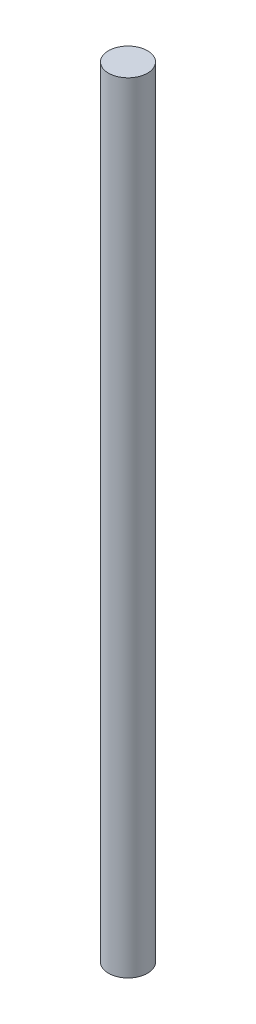
ISO-10303-21;
HEADER;
FILE_DESCRIPTION(('STEP AP214'),'2;1');
FILE_NAME('part.step','',(''),(''),'','','');
FILE_SCHEMA(('AUTOMOTIVE_DESIGN { 1 0 10303 214 1 1 1 1 }'));
ENDSEC;
DATA;
#1=APPLICATION_CONTEXT('core data for automotive mechanical design processes');
#2=APPLICATION_PROTOCOL_DEFINITION('international standard','automotive_design',2000,#1);
#3=PRODUCT_CONTEXT('',#1,'mechanical');
#4=PRODUCT('Part','Part','',(#3));
#5=PRODUCT_RELATED_PRODUCT_CATEGORY('part','',(#4));
#6=PRODUCT_DEFINITION_FORMATION('','',#4);
#7=PRODUCT_DEFINITION_CONTEXT('part definition',#1,'design');
#8=PRODUCT_DEFINITION('design','',#6,#7);
#9=PRODUCT_DEFINITION_SHAPE('','',#8);
#10=(LENGTH_UNIT() NAMED_UNIT(*) SI_UNIT(.MILLI.,.METRE.));
#11=(NAMED_UNIT(*) PLANE_ANGLE_UNIT() SI_UNIT($,.RADIAN.));
#12=(NAMED_UNIT(*) SI_UNIT($,.STERADIAN.) SOLID_ANGLE_UNIT());
#13=UNCERTAINTY_MEASURE_WITH_UNIT(LENGTH_MEASURE(1.E-05),#10,'distance_accuracy_value','');
#14=(GEOMETRIC_REPRESENTATION_CONTEXT(3) GLOBAL_UNCERTAINTY_ASSIGNED_CONTEXT((#13)) GLOBAL_UNIT_ASSIGNED_CONTEXT((#10,
#11,#12)) REPRESENTATION_CONTEXT('',''));
#15=CARTESIAN_POINT('',(0.,0.,0.));
#16=DIRECTION('',(0.,0.,1.));
#17=DIRECTION('',(1.,0.,0.));
#18=AXIS2_PLACEMENT_3D('',#15,#16,#17);
#19=CARTESIAN_POINT('',(0.,40.,0.));
#20=DIRECTION('',(0.,-1.,0.));
#21=DIRECTION('',(0.,0.,-1.));
#22=AXIS2_PLACEMENT_3D('',#19,#20,#21);
#23=CYLINDRICAL_SURFACE('',#22,1.);
#24=CARTESIAN_POINT('',(0.,40.,0.));
#25=DIRECTION('',(0.,1.,0.));
#26=DIRECTION('',(0.,0.,1.));
#27=AXIS2_PLACEMENT_3D('',#24,#25,#26);
#28=CIRCLE('',#27,1.);
#29=CARTESIAN_POINT('',(0.,40.,1.));
#30=VERTEX_POINT('',#29);
#31=EDGE_CURVE('E10',#30,#30,#28,.T.);
#32=ORIENTED_EDGE('',*,*,#31,.F.);
#33=EDGE_LOOP('',(#32));
#34=FACE_BOUND('',#33,.T.);
#35=CARTESIAN_POINT('',(0.,0.,0.));
#36=DIRECTION('',(0.,1.,0.));
#37=DIRECTION('',(0.,0.,1.));
#38=AXIS2_PLACEMENT_3D('',#35,#36,#37);
#39=CIRCLE('',#38,1.);
#40=CARTESIAN_POINT('',(0.,0.,1.));
#41=VERTEX_POINT('',#40);
#42=EDGE_CURVE('E42',#41,#41,#39,.T.);
#43=ORIENTED_EDGE('',*,*,#42,.T.);
#44=EDGE_LOOP('',(#43));
#45=FACE_BOUND('',#44,.T.);
#46=ADVANCED_FACE('F39',(#34,#45),#23,.T.);
#47=CARTESIAN_POINT('',(0.,40.,0.));
#48=DIRECTION('',(0.,1.,0.));
#49=DIRECTION('',(0.,0.,1.));
#50=AXIS2_PLACEMENT_3D('',#47,#48,#49);
#51=PLANE('',#50);
#52=ORIENTED_EDGE('',*,*,#31,.T.);
#53=EDGE_LOOP('',(#52));
#54=FACE_BOUND('',#53,.T.);
#55=ADVANCED_FACE('F54',(#54),#51,.T.);
#56=CARTESIAN_POINT('',(0.,0.,0.));
#57=DIRECTION('',(0.,1.,0.));
#58=DIRECTION('',(0.,0.,1.));
#59=AXIS2_PLACEMENT_3D('',#56,#57,#58);
#60=PLANE('',#59);
#61=ORIENTED_EDGE('',*,*,#42,.F.);
#62=EDGE_LOOP('',(#61));
#63=FACE_BOUND('',#62,.T.);
#64=ADVANCED_FACE('F52',(#63),#60,.F.);
#65=CLOSED_SHELL('',(#46,#55,#64));
#66=MANIFOLD_SOLID_BREP('B2',#65);
#67=ADVANCED_BREP_SHAPE_REPRESENTATION('',(#18,#66),#14);
#68=SHAPE_DEFINITION_REPRESENTATION(#9,#67);
ENDSEC;
END-ISO-10303-21;
